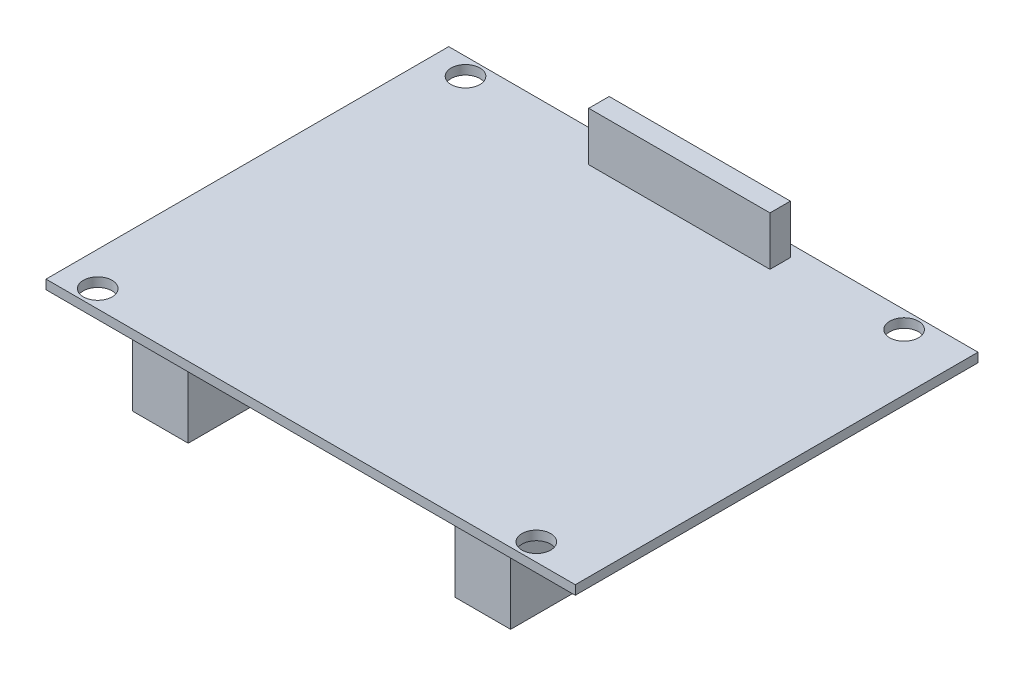
ISO-10303-21;
HEADER;
FILE_DESCRIPTION(('STEP AP214'),'2;1');
FILE_NAME('part.step','',(''),(''),'','','');
FILE_SCHEMA(('AUTOMOTIVE_DESIGN { 1 0 10303 214 1 1 1 1 }'));
ENDSEC;
DATA;
#1=APPLICATION_CONTEXT('core data for automotive mechanical design processes');
#2=APPLICATION_PROTOCOL_DEFINITION('international standard','automotive_design',2000,#1);
#3=PRODUCT_CONTEXT('',#1,'mechanical');
#4=PRODUCT('Part','Part','',(#3));
#5=PRODUCT_RELATED_PRODUCT_CATEGORY('part','',(#4));
#6=PRODUCT_DEFINITION_FORMATION('','',#4);
#7=PRODUCT_DEFINITION_CONTEXT('part definition',#1,'design');
#8=PRODUCT_DEFINITION('design','',#6,#7);
#9=PRODUCT_DEFINITION_SHAPE('','',#8);
#10=(LENGTH_UNIT() NAMED_UNIT(*) SI_UNIT(.MILLI.,.METRE.));
#11=(NAMED_UNIT(*) PLANE_ANGLE_UNIT() SI_UNIT($,.RADIAN.));
#12=(NAMED_UNIT(*) SI_UNIT($,.STERADIAN.) SOLID_ANGLE_UNIT());
#13=UNCERTAINTY_MEASURE_WITH_UNIT(LENGTH_MEASURE(1.E-05),#10,'distance_accuracy_value','');
#14=(GEOMETRIC_REPRESENTATION_CONTEXT(3) GLOBAL_UNCERTAINTY_ASSIGNED_CONTEXT((#13)) GLOBAL_UNIT_ASSIGNED_CONTEXT((#10,
#11,#12)) REPRESENTATION_CONTEXT('',''));
#15=CARTESIAN_POINT('',(0.,0.,0.));
#16=DIRECTION('',(0.,0.,1.));
#17=DIRECTION('',(1.,0.,0.));
#18=AXIS2_PLACEMENT_3D('',#15,#16,#17);
#19=CARTESIAN_POINT('',(0.,0.,0.));
#20=DIRECTION('',(0.,-1.,0.));
#21=DIRECTION('',(0.,0.,-1.));
#22=AXIS2_PLACEMENT_3D('',#19,#20,#21);
#23=PLANE('',#22);
#24=CARTESIAN_POINT('',(82.16,0.,-67.));
#25=DIRECTION('',(0.,1.,0.));
#26=DIRECTION('',(0.,0.,1.));
#27=AXIS2_PLACEMENT_3D('',#24,#25,#26);
#28=CIRCLE('',#27,2.50000000000001);
#29=CARTESIAN_POINT('',(82.16,0.,-64.5));
#30=VERTEX_POINT('',#29);
#31=EDGE_CURVE('E240',#30,#30,#28,.T.);
#32=ORIENTED_EDGE('',*,*,#31,.T.);
#33=EDGE_LOOP('',(#32));
#34=FACE_BOUND('',#33,.T.);
#35=CARTESIAN_POINT('',(5.92,0.,-3.07));
#36=DIRECTION('',(0.,1.,0.));
#37=DIRECTION('',(0.,0.,1.));
#38=AXIS2_PLACEMENT_3D('',#35,#36,#37);
#39=CIRCLE('',#38,2.5);
#40=CARTESIAN_POINT('',(5.92,0.,-0.569999999999999));
#41=VERTEX_POINT('',#40);
#42=EDGE_CURVE('E252',#41,#41,#39,.T.);
#43=ORIENTED_EDGE('',*,*,#42,.T.);
#44=EDGE_LOOP('',(#43));
#45=FACE_BOUND('',#44,.T.);
#46=DIRECTION('',(0.,0.,1.));
#47=VECTOR('',#46,1.);
#48=CARTESIAN_POINT('',(0.,0.,0.));
#49=LINE('',#48,#47);
#50=CARTESIAN_POINT('',(0.,0.,-70.));
#51=VERTEX_POINT('',#50);
#52=CARTESIAN_POINT('',(0.,0.,0.));
#53=VERTEX_POINT('',#52);
#54=EDGE_CURVE('E258',#51,#53,#49,.T.);
#55=ORIENTED_EDGE('',*,*,#54,.F.);
#56=DIRECTION('',(-1.,0.,0.));
#57=VECTOR('',#56,1.);
#58=CARTESIAN_POINT('',(0.,0.,-70.));
#59=LINE('',#58,#57);
#60=CARTESIAN_POINT('',(92.,0.,-70.));
#61=VERTEX_POINT('',#60);
#62=EDGE_CURVE('E265',#61,#51,#59,.T.);
#63=ORIENTED_EDGE('',*,*,#62,.F.);
#64=DIRECTION('',(0.,0.,-1.));
#65=VECTOR('',#64,1.);
#66=CARTESIAN_POINT('',(92.,0.,0.));
#67=LINE('',#66,#65);
#68=CARTESIAN_POINT('',(92.,0.,0.));
#69=VERTEX_POINT('',#68);
#70=EDGE_CURVE('E276',#69,#61,#67,.T.);
#71=ORIENTED_EDGE('',*,*,#70,.F.);
#72=DIRECTION('',(1.,0.,0.));
#73=VECTOR('',#72,1.);
#74=CARTESIAN_POINT('',(0.,0.,0.));
#75=LINE('',#74,#73);
#76=EDGE_CURVE('E274',#53,#69,#75,.T.);
#77=ORIENTED_EDGE('',*,*,#76,.F.);
#78=EDGE_LOOP('',(#55,#63,#71,#77));
#79=FACE_BOUND('',#78,.T.);
#80=CARTESIAN_POINT('',(82.16,0.,-3.07));
#81=DIRECTION('',(0.,1.,0.));
#82=DIRECTION('',(0.,0.,1.));
#83=AXIS2_PLACEMENT_3D('',#80,#81,#82);
#84=CIRCLE('',#83,2.50000000000001);
#85=CARTESIAN_POINT('',(82.16,0.,-0.569999999999991));
#86=VERTEX_POINT('',#85);
#87=EDGE_CURVE('E246',#86,#86,#84,.T.);
#88=ORIENTED_EDGE('',*,*,#87,.T.);
#89=EDGE_LOOP('',(#88));
#90=FACE_BOUND('',#89,.T.);
#91=CARTESIAN_POINT('',(5.92,0.,-67.));
#92=DIRECTION('',(0.,1.,0.));
#93=DIRECTION('',(0.,0.,1.));
#94=AXIS2_PLACEMENT_3D('',#91,#92,#93);
#95=CIRCLE('',#94,2.5);
#96=CARTESIAN_POINT('',(5.92,0.,-64.5));
#97=VERTEX_POINT('',#96);
#98=EDGE_CURVE('E236',#97,#97,#95,.T.);
#99=ORIENTED_EDGE('',*,*,#98,.T.);
#100=EDGE_LOOP('',(#99));
#101=FACE_BOUND('',#100,.T.);
#102=DIRECTION('',(-1.,0.,0.));
#103=VECTOR('',#102,1.);
#104=CARTESIAN_POINT('',(78.63,0.,-2.13));
#105=LINE('',#104,#103);
#106=CARTESIAN_POINT('',(78.63,0.,-2.13));
#107=VERTEX_POINT('',#106);
#108=CARTESIAN_POINT('',(68.92,0.,-2.13000000000001));
#109=VERTEX_POINT('',#108);
#110=EDGE_CURVE('E175',#107,#109,#105,.T.);
#111=ORIENTED_EDGE('',*,*,#110,.F.);
#112=DIRECTION('',(0.,0.,1.));
#113=VECTOR('',#112,1.);
#114=CARTESIAN_POINT('',(78.63,0.,-65.08));
#115=LINE('',#114,#113);
#116=CARTESIAN_POINT('',(78.63,0.,-65.08));
#117=VERTEX_POINT('',#116);
#118=EDGE_CURVE('E172',#117,#107,#115,.T.);
#119=ORIENTED_EDGE('',*,*,#118,.F.);
#120=DIRECTION('',(1.,0.,0.));
#121=VECTOR('',#120,1.);
#122=CARTESIAN_POINT('',(78.63,0.,-65.08));
#123=LINE('',#122,#121);
#124=CARTESIAN_POINT('',(68.92,0.,-65.08));
#125=VERTEX_POINT('',#124);
#126=EDGE_CURVE('E184',#125,#117,#123,.T.);
#127=ORIENTED_EDGE('',*,*,#126,.F.);
#128=DIRECTION('',(0.,0.,-1.));
#129=VECTOR('',#128,1.);
#130=CARTESIAN_POINT('',(68.92,0.,-65.08));
#131=LINE('',#130,#129);
#132=EDGE_CURVE('E192',#109,#125,#131,.T.);
#133=ORIENTED_EDGE('',*,*,#132,.F.);
#134=EDGE_LOOP('',(#111,#119,#127,#133));
#135=FACE_BOUND('',#134,.T.);
#136=DIRECTION('',(-1.,0.,0.));
#137=VECTOR('',#136,1.);
#138=CARTESIAN_POINT('',(22.59,0.,-2.13000000000001));
#139=LINE('',#138,#137);
#140=CARTESIAN_POINT('',(22.59,0.,-2.13000000000001));
#141=VERTEX_POINT('',#140);
#142=CARTESIAN_POINT('',(12.88,0.,-2.13));
#143=VERTEX_POINT('',#142);
#144=EDGE_CURVE('E545',#141,#143,#139,.T.);
#145=ORIENTED_EDGE('',*,*,#144,.F.);
#146=DIRECTION('',(0.,0.,1.));
#147=VECTOR('',#146,1.);
#148=CARTESIAN_POINT('',(22.59,0.,-65.19));
#149=LINE('',#148,#147);
#150=CARTESIAN_POINT('',(22.59,0.,-65.19));
#151=VERTEX_POINT('',#150);
#152=EDGE_CURVE('E170',#151,#141,#149,.T.);
#153=ORIENTED_EDGE('',*,*,#152,.F.);
#154=DIRECTION('',(1.,0.,0.));
#155=VECTOR('',#154,1.);
#156=CARTESIAN_POINT('',(22.59,0.,-65.19));
#157=LINE('',#156,#155);
#158=CARTESIAN_POINT('',(12.88,0.,-65.19));
#159=VERTEX_POINT('',#158);
#160=EDGE_CURVE('E166',#159,#151,#157,.T.);
#161=ORIENTED_EDGE('',*,*,#160,.F.);
#162=DIRECTION('',(0.,0.,-1.));
#163=VECTOR('',#162,1.);
#164=CARTESIAN_POINT('',(12.88,0.,-65.19));
#165=LINE('',#164,#163);
#166=EDGE_CURVE('E542',#143,#159,#165,.T.);
#167=ORIENTED_EDGE('',*,*,#166,.F.);
#168=EDGE_LOOP('',(#145,#153,#161,#167));
#169=FACE_BOUND('',#168,.T.);
#170=ADVANCED_FACE('F33',(#34,#45,#79,#90,#101,#135,#169),#23,.T.);
#171=CARTESIAN_POINT('',(0.,1.6,0.));
#172=DIRECTION('',(0.,-1.,0.));
#173=DIRECTION('',(0.,0.,-1.));
#174=AXIS2_PLACEMENT_3D('',#171,#172,#173);
#175=PLANE('',#174);
#176=CARTESIAN_POINT('',(5.92,1.6,-67.));
#177=DIRECTION('',(0.,1.,0.));
#178=DIRECTION('',(0.,0.,1.));
#179=AXIS2_PLACEMENT_3D('',#176,#177,#178);
#180=CIRCLE('',#179,2.5);
#181=CARTESIAN_POINT('',(5.92,1.6,-64.5));
#182=VERTEX_POINT('',#181);
#183=EDGE_CURVE('E237',#182,#182,#180,.T.);
#184=ORIENTED_EDGE('',*,*,#183,.F.);
#185=EDGE_LOOP('',(#184));
#186=FACE_BOUND('',#185,.T.);
#187=CARTESIAN_POINT('',(82.16,1.6,-67.));
#188=DIRECTION('',(0.,1.,0.));
#189=DIRECTION('',(0.,0.,1.));
#190=AXIS2_PLACEMENT_3D('',#187,#188,#189);
#191=CIRCLE('',#190,2.50000000000001);
#192=CARTESIAN_POINT('',(82.16,1.6,-64.5));
#193=VERTEX_POINT('',#192);
#194=EDGE_CURVE('E243',#193,#193,#191,.T.);
#195=ORIENTED_EDGE('',*,*,#194,.F.);
#196=EDGE_LOOP('',(#195));
#197=FACE_BOUND('',#196,.T.);
#198=CARTESIAN_POINT('',(82.16,1.6,-3.07));
#199=DIRECTION('',(0.,1.,0.));
#200=DIRECTION('',(0.,0.,1.));
#201=AXIS2_PLACEMENT_3D('',#198,#199,#200);
#202=CIRCLE('',#201,2.50000000000001);
#203=CARTESIAN_POINT('',(82.16,1.6,-0.569999999999991));
#204=VERTEX_POINT('',#203);
#205=EDGE_CURVE('E249',#204,#204,#202,.T.);
#206=ORIENTED_EDGE('',*,*,#205,.F.);
#207=EDGE_LOOP('',(#206));
#208=FACE_BOUND('',#207,.T.);
#209=CARTESIAN_POINT('',(5.92,1.6,-3.07));
#210=DIRECTION('',(0.,1.,0.));
#211=DIRECTION('',(0.,0.,1.));
#212=AXIS2_PLACEMENT_3D('',#209,#210,#211);
#213=CIRCLE('',#212,2.5);
#214=CARTESIAN_POINT('',(5.92,1.6,-0.569999999999999));
#215=VERTEX_POINT('',#214);
#216=EDGE_CURVE('E255',#215,#215,#213,.T.);
#217=ORIENTED_EDGE('',*,*,#216,.F.);
#218=EDGE_LOOP('',(#217));
#219=FACE_BOUND('',#218,.T.);
#220=DIRECTION('',(0.,0.,1.));
#221=VECTOR('',#220,1.);
#222=CARTESIAN_POINT('',(0.,1.6,0.));
#223=LINE('',#222,#221);
#224=CARTESIAN_POINT('',(0.,1.6,-70.));
#225=VERTEX_POINT('',#224);
#226=CARTESIAN_POINT('',(0.,1.6,0.));
#227=VERTEX_POINT('',#226);
#228=EDGE_CURVE('E261',#225,#227,#223,.T.);
#229=ORIENTED_EDGE('',*,*,#228,.T.);
#230=DIRECTION('',(1.,0.,0.));
#231=VECTOR('',#230,1.);
#232=CARTESIAN_POINT('',(0.,1.6,0.));
#233=LINE('',#232,#231);
#234=CARTESIAN_POINT('',(92.,1.6,0.));
#235=VERTEX_POINT('',#234);
#236=EDGE_CURVE('E264',#227,#235,#233,.T.);
#237=ORIENTED_EDGE('',*,*,#236,.T.);
#238=DIRECTION('',(0.,0.,-1.));
#239=VECTOR('',#238,1.);
#240=CARTESIAN_POINT('',(92.,1.6,0.));
#241=LINE('',#240,#239);
#242=CARTESIAN_POINT('',(92.,1.6,-70.));
#243=VERTEX_POINT('',#242);
#244=EDGE_CURVE('E267',#235,#243,#241,.T.);
#245=ORIENTED_EDGE('',*,*,#244,.T.);
#246=DIRECTION('',(-1.,0.,0.));
#247=VECTOR('',#246,1.);
#248=CARTESIAN_POINT('',(0.,1.6,-70.));
#249=LINE('',#248,#247);
#250=EDGE_CURVE('E269',#243,#225,#249,.T.);
#251=ORIENTED_EDGE('',*,*,#250,.T.);
#252=EDGE_LOOP('',(#229,#237,#245,#251));
#253=FACE_BOUND('',#252,.T.);
#254=DIRECTION('',(0.,0.,1.));
#255=VECTOR('',#254,1.);
#256=CARTESIAN_POINT('',(29.95,1.6,-67.94));
#257=LINE('',#256,#255);
#258=CARTESIAN_POINT('',(29.95,1.6,-67.94));
#259=VERTEX_POINT('',#258);
#260=CARTESIAN_POINT('',(29.95,1.6,-64.39));
#261=VERTEX_POINT('',#260);
#262=EDGE_CURVE('E203',#259,#261,#257,.T.);
#263=ORIENTED_EDGE('',*,*,#262,.F.);
#264=DIRECTION('',(-1.,0.,0.));
#265=VECTOR('',#264,1.);
#266=CARTESIAN_POINT('',(29.95,1.6,-67.94));
#267=LINE('',#266,#265);
#268=CARTESIAN_POINT('',(61.45,1.6,-67.94));
#269=VERTEX_POINT('',#268);
#270=EDGE_CURVE('E208',#269,#259,#267,.T.);
#271=ORIENTED_EDGE('',*,*,#270,.F.);
#272=DIRECTION('',(0.,0.,-1.));
#273=VECTOR('',#272,1.);
#274=CARTESIAN_POINT('',(61.45,1.6,-67.94));
#275=LINE('',#274,#273);
#276=CARTESIAN_POINT('',(61.45,1.6,-64.39));
#277=VERTEX_POINT('',#276);
#278=EDGE_CURVE('E220',#277,#269,#275,.T.);
#279=ORIENTED_EDGE('',*,*,#278,.F.);
#280=DIRECTION('',(1.,0.,0.));
#281=VECTOR('',#280,1.);
#282=CARTESIAN_POINT('',(29.95,1.6,-64.39));
#283=LINE('',#282,#281);
#284=EDGE_CURVE('E217',#261,#277,#283,.T.);
#285=ORIENTED_EDGE('',*,*,#284,.F.);
#286=EDGE_LOOP('',(#263,#271,#279,#285));
#287=FACE_BOUND('',#286,.T.);
#288=ADVANCED_FACE('F303',(#186,#197,#208,#219,#253,#287),#175,.F.);
#289=CARTESIAN_POINT('',(0.,1.6,0.));
#290=DIRECTION('',(1.,0.,0.));
#291=DIRECTION('',(0.,0.,-1.));
#292=AXIS2_PLACEMENT_3D('',#289,#290,#291);
#293=PLANE('',#292);
#294=ORIENTED_EDGE('',*,*,#54,.T.);
#295=DIRECTION('',(0.,-1.,0.));
#296=VECTOR('',#295,1.);
#297=CARTESIAN_POINT('',(0.,1.6,0.));
#298=LINE('',#297,#296);
#299=EDGE_CURVE('E11',#227,#53,#298,.T.);
#300=ORIENTED_EDGE('',*,*,#299,.F.);
#301=ORIENTED_EDGE('',*,*,#228,.F.);
#302=DIRECTION('',(0.,-1.,0.));
#303=VECTOR('',#302,1.);
#304=CARTESIAN_POINT('',(0.,1.6,-70.));
#305=LINE('',#304,#303);
#306=EDGE_CURVE('E271',#225,#51,#305,.T.);
#307=ORIENTED_EDGE('',*,*,#306,.T.);
#308=EDGE_LOOP('',(#294,#300,#301,#307));
#309=FACE_BOUND('',#308,.T.);
#310=ADVANCED_FACE('F35',(#309),#293,.F.);
#311=CARTESIAN_POINT('',(0.,1.6,0.));
#312=DIRECTION('',(0.,0.,-1.));
#313=DIRECTION('',(-1.,0.,0.));
#314=AXIS2_PLACEMENT_3D('',#311,#312,#313);
#315=PLANE('',#314);
#316=ORIENTED_EDGE('',*,*,#76,.T.);
#317=DIRECTION('',(0.,-1.,0.));
#318=VECTOR('',#317,1.);
#319=CARTESIAN_POINT('',(92.,1.6,0.));
#320=LINE('',#319,#318);
#321=EDGE_CURVE('E41',#235,#69,#320,.T.);
#322=ORIENTED_EDGE('',*,*,#321,.F.);
#323=ORIENTED_EDGE('',*,*,#236,.F.);
#324=ORIENTED_EDGE('',*,*,#299,.T.);
#325=EDGE_LOOP('',(#316,#322,#323,#324));
#326=FACE_BOUND('',#325,.T.);
#327=ADVANCED_FACE('F305',(#326),#315,.F.);
#328=CARTESIAN_POINT('',(92.,1.6,0.));
#329=DIRECTION('',(-1.,0.,0.));
#330=DIRECTION('',(0.,0.,1.));
#331=AXIS2_PLACEMENT_3D('',#328,#329,#330);
#332=PLANE('',#331);
#333=ORIENTED_EDGE('',*,*,#70,.T.);
#334=DIRECTION('',(0.,-1.,0.));
#335=VECTOR('',#334,1.);
#336=CARTESIAN_POINT('',(92.,1.6,-70.));
#337=LINE('',#336,#335);
#338=EDGE_CURVE('E281',#243,#61,#337,.T.);
#339=ORIENTED_EDGE('',*,*,#338,.F.);
#340=ORIENTED_EDGE('',*,*,#244,.F.);
#341=ORIENTED_EDGE('',*,*,#321,.T.);
#342=EDGE_LOOP('',(#333,#339,#340,#341));
#343=FACE_BOUND('',#342,.T.);
#344=ADVANCED_FACE('F288',(#343),#332,.F.);
#345=CARTESIAN_POINT('',(0.,1.6,-70.));
#346=DIRECTION('',(0.,0.,1.));
#347=DIRECTION('',(1.,0.,0.));
#348=AXIS2_PLACEMENT_3D('',#345,#346,#347);
#349=PLANE('',#348);
#350=ORIENTED_EDGE('',*,*,#62,.T.);
#351=ORIENTED_EDGE('',*,*,#306,.F.);
#352=ORIENTED_EDGE('',*,*,#250,.F.);
#353=ORIENTED_EDGE('',*,*,#338,.T.);
#354=EDGE_LOOP('',(#350,#351,#352,#353));
#355=FACE_BOUND('',#354,.T.);
#356=ADVANCED_FACE('F297',(#355),#349,.F.);
#357=CARTESIAN_POINT('',(5.92,1.6,-3.07));
#358=DIRECTION('',(0.,-1.,0.));
#359=DIRECTION('',(0.,0.,-1.));
#360=AXIS2_PLACEMENT_3D('',#357,#358,#359);
#361=CYLINDRICAL_SURFACE('',#360,2.5);
#362=ORIENTED_EDGE('',*,*,#216,.T.);
#363=EDGE_LOOP('',(#362));
#364=FACE_BOUND('',#363,.T.);
#365=ORIENTED_EDGE('',*,*,#42,.F.);
#366=EDGE_LOOP('',(#365));
#367=FACE_BOUND('',#366,.T.);
#368=ADVANCED_FACE('F324',(#364,#367),#361,.F.);
#369=CARTESIAN_POINT('',(82.16,1.6,-3.07));
#370=DIRECTION('',(0.,-1.,0.));
#371=DIRECTION('',(0.,0.,-1.));
#372=AXIS2_PLACEMENT_3D('',#369,#370,#371);
#373=CYLINDRICAL_SURFACE('',#372,2.50000000000001);
#374=ORIENTED_EDGE('',*,*,#205,.T.);
#375=EDGE_LOOP('',(#374));
#376=FACE_BOUND('',#375,.T.);
#377=ORIENTED_EDGE('',*,*,#87,.F.);
#378=EDGE_LOOP('',(#377));
#379=FACE_BOUND('',#378,.T.);
#380=ADVANCED_FACE('F328',(#376,#379),#373,.F.);
#381=CARTESIAN_POINT('',(82.16,1.6,-67.));
#382=DIRECTION('',(0.,-1.,0.));
#383=DIRECTION('',(0.,0.,-1.));
#384=AXIS2_PLACEMENT_3D('',#381,#382,#383);
#385=CYLINDRICAL_SURFACE('',#384,2.50000000000001);
#386=ORIENTED_EDGE('',*,*,#194,.T.);
#387=EDGE_LOOP('',(#386));
#388=FACE_BOUND('',#387,.T.);
#389=ORIENTED_EDGE('',*,*,#31,.F.);
#390=EDGE_LOOP('',(#389));
#391=FACE_BOUND('',#390,.T.);
#392=ADVANCED_FACE('F333',(#388,#391),#385,.F.);
#393=CARTESIAN_POINT('',(5.92,1.6,-67.));
#394=DIRECTION('',(0.,-1.,0.));
#395=DIRECTION('',(0.,0.,-1.));
#396=AXIS2_PLACEMENT_3D('',#393,#394,#395);
#397=CYLINDRICAL_SURFACE('',#396,2.5);
#398=ORIENTED_EDGE('',*,*,#183,.T.);
#399=EDGE_LOOP('',(#398));
#400=FACE_BOUND('',#399,.T.);
#401=ORIENTED_EDGE('',*,*,#98,.F.);
#402=EDGE_LOOP('',(#401));
#403=FACE_BOUND('',#402,.T.);
#404=ADVANCED_FACE('F340',(#400,#403),#397,.F.);
#405=CARTESIAN_POINT('',(29.95,10.1,-67.94));
#406=DIRECTION('',(1.,0.,0.));
#407=DIRECTION('',(0.,0.,-1.));
#408=AXIS2_PLACEMENT_3D('',#405,#406,#407);
#409=PLANE('',#408);
#410=ORIENTED_EDGE('',*,*,#262,.T.);
#411=DIRECTION('',(0.,-1.,0.));
#412=VECTOR('',#411,1.);
#413=CARTESIAN_POINT('',(29.95,10.1,-64.39));
#414=LINE('',#413,#412);
#415=CARTESIAN_POINT('',(29.95,10.1,-64.39));
#416=VERTEX_POINT('',#415);
#417=EDGE_CURVE('E233',#416,#261,#414,.T.);
#418=ORIENTED_EDGE('',*,*,#417,.F.);
#419=DIRECTION('',(0.,0.,1.));
#420=VECTOR('',#419,1.);
#421=CARTESIAN_POINT('',(29.95,10.1,-67.94));
#422=LINE('',#421,#420);
#423=CARTESIAN_POINT('',(29.95,10.1,-67.94));
#424=VERTEX_POINT('',#423);
#425=EDGE_CURVE('E204',#424,#416,#422,.T.);
#426=ORIENTED_EDGE('',*,*,#425,.F.);
#427=DIRECTION('',(0.,-1.,0.));
#428=VECTOR('',#427,1.);
#429=CARTESIAN_POINT('',(29.95,10.1,-67.94));
#430=LINE('',#429,#428);
#431=EDGE_CURVE('E214',#424,#259,#430,.T.);
#432=ORIENTED_EDGE('',*,*,#431,.T.);
#433=EDGE_LOOP('',(#410,#418,#426,#432));
#434=FACE_BOUND('',#433,.T.);
#435=ADVANCED_FACE('F344',(#434),#409,.F.);
#436=CARTESIAN_POINT('',(29.95,10.1,-64.39));
#437=DIRECTION('',(0.,0.,-1.));
#438=DIRECTION('',(-1.,0.,0.));
#439=AXIS2_PLACEMENT_3D('',#436,#437,#438);
#440=PLANE('',#439);
#441=ORIENTED_EDGE('',*,*,#284,.T.);
#442=DIRECTION('',(0.,-1.,0.));
#443=VECTOR('',#442,1.);
#444=CARTESIAN_POINT('',(61.45,10.1,-64.39));
#445=LINE('',#444,#443);
#446=CARTESIAN_POINT('',(61.45,10.1,-64.39));
#447=VERTEX_POINT('',#446);
#448=EDGE_CURVE('E230',#447,#277,#445,.T.);
#449=ORIENTED_EDGE('',*,*,#448,.F.);
#450=DIRECTION('',(1.,0.,0.));
#451=VECTOR('',#450,1.);
#452=CARTESIAN_POINT('',(29.95,10.1,-64.39));
#453=LINE('',#452,#451);
#454=EDGE_CURVE('E207',#416,#447,#453,.T.);
#455=ORIENTED_EDGE('',*,*,#454,.F.);
#456=ORIENTED_EDGE('',*,*,#417,.T.);
#457=EDGE_LOOP('',(#441,#449,#455,#456));
#458=FACE_BOUND('',#457,.T.);
#459=ADVANCED_FACE('F348',(#458),#440,.F.);
#460=CARTESIAN_POINT('',(61.45,10.1,-67.94));
#461=DIRECTION('',(-1.,0.,0.));
#462=DIRECTION('',(0.,0.,1.));
#463=AXIS2_PLACEMENT_3D('',#460,#461,#462);
#464=PLANE('',#463);
#465=ORIENTED_EDGE('',*,*,#278,.T.);
#466=DIRECTION('',(0.,-1.,0.));
#467=VECTOR('',#466,1.);
#468=CARTESIAN_POINT('',(61.45,10.1,-67.94));
#469=LINE('',#468,#467);
#470=CARTESIAN_POINT('',(61.45,10.1,-67.94));
#471=VERTEX_POINT('',#470);
#472=EDGE_CURVE('E227',#471,#269,#469,.T.);
#473=ORIENTED_EDGE('',*,*,#472,.F.);
#474=DIRECTION('',(0.,0.,-1.));
#475=VECTOR('',#474,1.);
#476=CARTESIAN_POINT('',(61.45,10.1,-67.94));
#477=LINE('',#476,#475);
#478=EDGE_CURVE('E210',#447,#471,#477,.T.);
#479=ORIENTED_EDGE('',*,*,#478,.F.);
#480=ORIENTED_EDGE('',*,*,#448,.T.);
#481=EDGE_LOOP('',(#465,#473,#479,#480));
#482=FACE_BOUND('',#481,.T.);
#483=ADVANCED_FACE('F352',(#482),#464,.F.);
#484=CARTESIAN_POINT('',(29.95,10.1,-67.94));
#485=DIRECTION('',(0.,0.,1.));
#486=DIRECTION('',(1.,0.,0.));
#487=AXIS2_PLACEMENT_3D('',#484,#485,#486);
#488=PLANE('',#487);
#489=ORIENTED_EDGE('',*,*,#270,.T.);
#490=ORIENTED_EDGE('',*,*,#431,.F.);
#491=DIRECTION('',(-1.,0.,0.));
#492=VECTOR('',#491,1.);
#493=CARTESIAN_POINT('',(29.95,10.1,-67.94));
#494=LINE('',#493,#492);
#495=EDGE_CURVE('E212',#471,#424,#494,.T.);
#496=ORIENTED_EDGE('',*,*,#495,.F.);
#497=ORIENTED_EDGE('',*,*,#472,.T.);
#498=EDGE_LOOP('',(#489,#490,#496,#497));
#499=FACE_BOUND('',#498,.T.);
#500=ADVANCED_FACE('F356',(#499),#488,.F.);
#501=CARTESIAN_POINT('',(0.,10.1,0.));
#502=DIRECTION('',(0.,1.,0.));
#503=DIRECTION('',(0.,0.,1.));
#504=AXIS2_PLACEMENT_3D('',#501,#502,#503);
#505=PLANE('',#504);
#506=ORIENTED_EDGE('',*,*,#425,.T.);
#507=ORIENTED_EDGE('',*,*,#454,.T.);
#508=ORIENTED_EDGE('',*,*,#478,.T.);
#509=ORIENTED_EDGE('',*,*,#495,.T.);
#510=EDGE_LOOP('',(#506,#507,#508,#509));
#511=FACE_BOUND('',#510,.T.);
#512=ADVANCED_FACE('F360',(#511),#505,.T.);
#513=CARTESIAN_POINT('',(78.63,-12.88,-65.08));
#514=DIRECTION('',(-1.,0.,0.));
#515=DIRECTION('',(0.,0.,1.));
#516=AXIS2_PLACEMENT_3D('',#513,#514,#515);
#517=PLANE('',#516);
#518=ORIENTED_EDGE('',*,*,#118,.T.);
#519=DIRECTION('',(0.,1.,0.));
#520=VECTOR('',#519,1.);
#521=CARTESIAN_POINT('',(78.63,-12.88,-2.13));
#522=LINE('',#521,#520);
#523=CARTESIAN_POINT('',(78.63,-12.88,-2.13));
#524=VERTEX_POINT('',#523);
#525=EDGE_CURVE('E201',#524,#107,#522,.T.);
#526=ORIENTED_EDGE('',*,*,#525,.F.);
#527=DIRECTION('',(0.,0.,1.));
#528=VECTOR('',#527,1.);
#529=CARTESIAN_POINT('',(78.63,-12.88,-65.08));
#530=LINE('',#529,#528);
#531=CARTESIAN_POINT('',(78.63,-12.88,-65.08));
#532=VERTEX_POINT('',#531);
#533=EDGE_CURVE('E180',#532,#524,#530,.T.);
#534=ORIENTED_EDGE('',*,*,#533,.F.);
#535=DIRECTION('',(0.,1.,0.));
#536=VECTOR('',#535,1.);
#537=CARTESIAN_POINT('',(78.63,-12.88,-65.08));
#538=LINE('',#537,#536);
#539=EDGE_CURVE('E189',#532,#117,#538,.T.);
#540=ORIENTED_EDGE('',*,*,#539,.T.);
#541=EDGE_LOOP('',(#518,#526,#534,#540));
#542=FACE_BOUND('',#541,.T.);
#543=ADVANCED_FACE('F364',(#542),#517,.F.);
#544=CARTESIAN_POINT('',(78.63,-12.88,-2.13));
#545=DIRECTION('',(0.,0.,-1.));
#546=DIRECTION('',(-1.,0.,0.));
#547=AXIS2_PLACEMENT_3D('',#544,#545,#546);
#548=PLANE('',#547);
#549=ORIENTED_EDGE('',*,*,#110,.T.);
#550=DIRECTION('',(0.,1.,0.));
#551=VECTOR('',#550,1.);
#552=CARTESIAN_POINT('',(68.92,-12.88,-2.13000000000001));
#553=LINE('',#552,#551);
#554=CARTESIAN_POINT('',(68.92,-12.88,-2.13000000000001));
#555=VERTEX_POINT('',#554);
#556=EDGE_CURVE('E198',#555,#109,#553,.T.);
#557=ORIENTED_EDGE('',*,*,#556,.F.);
#558=DIRECTION('',(-1.,0.,0.));
#559=VECTOR('',#558,1.);
#560=CARTESIAN_POINT('',(78.63,-12.88,-2.13));
#561=LINE('',#560,#559);
#562=EDGE_CURVE('E183',#524,#555,#561,.T.);
#563=ORIENTED_EDGE('',*,*,#562,.F.);
#564=ORIENTED_EDGE('',*,*,#525,.T.);
#565=EDGE_LOOP('',(#549,#557,#563,#564));
#566=FACE_BOUND('',#565,.T.);
#567=ADVANCED_FACE('F368',(#566),#548,.F.);
#568=CARTESIAN_POINT('',(68.92,-12.88,-65.08));
#569=DIRECTION('',(1.,0.,0.));
#570=DIRECTION('',(0.,0.,-1.));
#571=AXIS2_PLACEMENT_3D('',#568,#569,#570);
#572=PLANE('',#571);
#573=ORIENTED_EDGE('',*,*,#132,.T.);
#574=DIRECTION('',(0.,1.,0.));
#575=VECTOR('',#574,1.);
#576=CARTESIAN_POINT('',(68.92,-12.88,-65.08));
#577=LINE('',#576,#575);
#578=CARTESIAN_POINT('',(68.92,-12.88,-65.08));
#579=VERTEX_POINT('',#578);
#580=EDGE_CURVE('E56',#579,#125,#577,.T.);
#581=ORIENTED_EDGE('',*,*,#580,.F.);
#582=DIRECTION('',(0.,0.,-1.));
#583=VECTOR('',#582,1.);
#584=CARTESIAN_POINT('',(68.92,-12.88,-65.08));
#585=LINE('',#584,#583);
#586=EDGE_CURVE('E186',#555,#579,#585,.T.);
#587=ORIENTED_EDGE('',*,*,#586,.F.);
#588=ORIENTED_EDGE('',*,*,#556,.T.);
#589=EDGE_LOOP('',(#573,#581,#587,#588));
#590=FACE_BOUND('',#589,.T.);
#591=ADVANCED_FACE('F372',(#590),#572,.F.);
#592=CARTESIAN_POINT('',(78.63,-12.88,-65.08));
#593=DIRECTION('',(0.,0.,1.));
#594=DIRECTION('',(1.,0.,0.));
#595=AXIS2_PLACEMENT_3D('',#592,#593,#594);
#596=PLANE('',#595);
#597=ORIENTED_EDGE('',*,*,#126,.T.);
#598=ORIENTED_EDGE('',*,*,#539,.F.);
#599=DIRECTION('',(1.,0.,0.));
#600=VECTOR('',#599,1.);
#601=CARTESIAN_POINT('',(78.63,-12.88,-65.08));
#602=LINE('',#601,#600);
#603=EDGE_CURVE('E188',#579,#532,#602,.T.);
#604=ORIENTED_EDGE('',*,*,#603,.F.);
#605=ORIENTED_EDGE('',*,*,#580,.T.);
#606=EDGE_LOOP('',(#597,#598,#604,#605));
#607=FACE_BOUND('',#606,.T.);
#608=ADVANCED_FACE('F376',(#607),#596,.F.);
#609=CARTESIAN_POINT('',(0.,-12.88,0.));
#610=DIRECTION('',(0.,-1.,0.));
#611=DIRECTION('',(0.,0.,-1.));
#612=AXIS2_PLACEMENT_3D('',#609,#610,#611);
#613=PLANE('',#612);
#614=ORIENTED_EDGE('',*,*,#533,.T.);
#615=ORIENTED_EDGE('',*,*,#562,.T.);
#616=ORIENTED_EDGE('',*,*,#586,.T.);
#617=ORIENTED_EDGE('',*,*,#603,.T.);
#618=EDGE_LOOP('',(#614,#615,#616,#617));
#619=FACE_BOUND('',#618,.T.);
#620=ADVANCED_FACE('F380',(#619),#613,.T.);
#621=CARTESIAN_POINT('',(22.59,-12.88,-65.19));
#622=DIRECTION('',(-1.,0.,0.));
#623=DIRECTION('',(0.,0.,1.));
#624=AXIS2_PLACEMENT_3D('',#621,#622,#623);
#625=PLANE('',#624);
#626=ORIENTED_EDGE('',*,*,#152,.T.);
#627=DIRECTION('',(0.,1.,0.));
#628=VECTOR('',#627,1.);
#629=CARTESIAN_POINT('',(22.59,-12.88,-2.13000000000001));
#630=LINE('',#629,#628);
#631=CARTESIAN_POINT('',(22.59,-12.88,-2.13000000000001));
#632=VERTEX_POINT('',#631);
#633=EDGE_CURVE('E151',#632,#141,#630,.T.);
#634=ORIENTED_EDGE('',*,*,#633,.F.);
#635=DIRECTION('',(0.,0.,1.));
#636=VECTOR('',#635,1.);
#637=CARTESIAN_POINT('',(22.59,-12.88,-65.19));
#638=LINE('',#637,#636);
#639=CARTESIAN_POINT('',(22.59,-12.88,-65.19));
#640=VERTEX_POINT('',#639);
#641=EDGE_CURVE('E158',#640,#632,#638,.T.);
#642=ORIENTED_EDGE('',*,*,#641,.F.);
#643=DIRECTION('',(0.,1.,0.));
#644=VECTOR('',#643,1.);
#645=CARTESIAN_POINT('',(22.59,-12.88,-65.19));
#646=LINE('',#645,#644);
#647=EDGE_CURVE('E539',#640,#151,#646,.T.);
#648=ORIENTED_EDGE('',*,*,#647,.T.);
#649=EDGE_LOOP('',(#626,#634,#642,#648));
#650=FACE_BOUND('',#649,.T.);
#651=ADVANCED_FACE('F168',(#650),#625,.F.);
#652=CARTESIAN_POINT('',(22.59,-12.88,-2.13000000000001));
#653=DIRECTION('',(0.,0.,-1.));
#654=DIRECTION('',(-1.,0.,0.));
#655=AXIS2_PLACEMENT_3D('',#652,#653,#654);
#656=PLANE('',#655);
#657=ORIENTED_EDGE('',*,*,#144,.T.);
#658=DIRECTION('',(0.,1.,0.));
#659=VECTOR('',#658,1.);
#660=CARTESIAN_POINT('',(12.88,-12.88,-2.13));
#661=LINE('',#660,#659);
#662=CARTESIAN_POINT('',(12.88,-12.88,-2.13));
#663=VERTEX_POINT('',#662);
#664=EDGE_CURVE('E154',#663,#143,#661,.T.);
#665=ORIENTED_EDGE('',*,*,#664,.F.);
#666=DIRECTION('',(-1.,0.,0.));
#667=VECTOR('',#666,1.);
#668=CARTESIAN_POINT('',(22.59,-12.88,-2.13000000000001));
#669=LINE('',#668,#667);
#670=EDGE_CURVE('E147',#632,#663,#669,.T.);
#671=ORIENTED_EDGE('',*,*,#670,.F.);
#672=ORIENTED_EDGE('',*,*,#633,.T.);
#673=EDGE_LOOP('',(#657,#665,#671,#672));
#674=FACE_BOUND('',#673,.T.);
#675=ADVANCED_FACE('F149',(#674),#656,.F.);
#676=CARTESIAN_POINT('',(12.88,-12.88,-65.19));
#677=DIRECTION('',(1.,0.,0.));
#678=DIRECTION('',(0.,0.,-1.));
#679=AXIS2_PLACEMENT_3D('',#676,#677,#678);
#680=PLANE('',#679);
#681=ORIENTED_EDGE('',*,*,#166,.T.);
#682=DIRECTION('',(0.,1.,0.));
#683=VECTOR('',#682,1.);
#684=CARTESIAN_POINT('',(12.88,-12.88,-65.19));
#685=LINE('',#684,#683);
#686=CARTESIAN_POINT('',(12.88,-12.88,-65.19));
#687=VERTEX_POINT('',#686);
#688=EDGE_CURVE('E48',#687,#159,#685,.T.);
#689=ORIENTED_EDGE('',*,*,#688,.F.);
#690=DIRECTION('',(0.,0.,-1.));
#691=VECTOR('',#690,1.);
#692=CARTESIAN_POINT('',(12.88,-12.88,-65.19));
#693=LINE('',#692,#691);
#694=EDGE_CURVE('E157',#663,#687,#693,.T.);
#695=ORIENTED_EDGE('',*,*,#694,.F.);
#696=ORIENTED_EDGE('',*,*,#664,.T.);
#697=EDGE_LOOP('',(#681,#689,#695,#696));
#698=FACE_BOUND('',#697,.T.);
#699=ADVANCED_FACE('F388',(#698),#680,.F.);
#700=CARTESIAN_POINT('',(22.59,-12.88,-65.19));
#701=DIRECTION('',(0.,0.,1.));
#702=DIRECTION('',(1.,0.,0.));
#703=AXIS2_PLACEMENT_3D('',#700,#701,#702);
#704=PLANE('',#703);
#705=ORIENTED_EDGE('',*,*,#160,.T.);
#706=ORIENTED_EDGE('',*,*,#647,.F.);
#707=DIRECTION('',(1.,0.,0.));
#708=VECTOR('',#707,1.);
#709=CARTESIAN_POINT('',(22.59,-12.88,-65.19));
#710=LINE('',#709,#708);
#711=EDGE_CURVE('E162',#687,#640,#710,.T.);
#712=ORIENTED_EDGE('',*,*,#711,.F.);
#713=ORIENTED_EDGE('',*,*,#688,.T.);
#714=EDGE_LOOP('',(#705,#706,#712,#713));
#715=FACE_BOUND('',#714,.T.);
#716=ADVANCED_FACE('F391',(#715),#704,.F.);
#717=CARTESIAN_POINT('',(0.,-12.88,0.));
#718=DIRECTION('',(0.,-1.,0.));
#719=DIRECTION('',(0.,0.,-1.));
#720=AXIS2_PLACEMENT_3D('',#717,#718,#719);
#721=PLANE('',#720);
#722=ORIENTED_EDGE('',*,*,#641,.T.);
#723=ORIENTED_EDGE('',*,*,#670,.T.);
#724=ORIENTED_EDGE('',*,*,#694,.T.);
#725=ORIENTED_EDGE('',*,*,#711,.T.);
#726=EDGE_LOOP('',(#722,#723,#724,#725));
#727=FACE_BOUND('',#726,.T.);
#728=ADVANCED_FACE('F161',(#727),#721,.T.);
#729=CLOSED_SHELL('',(#170,#288,#310,#327,#344,#356,#368,#380,#392,#404,#435,#459,#483,#500,
#512,#543,#567,#591,#608,#620,#651,#675,#699,#716,#728));
#730=MANIFOLD_SOLID_BREP('B2',#729);
#731=ADVANCED_BREP_SHAPE_REPRESENTATION('',(#18,#730),#14);
#732=SHAPE_DEFINITION_REPRESENTATION(#9,#731);
ENDSEC;
END-ISO-10303-21;
